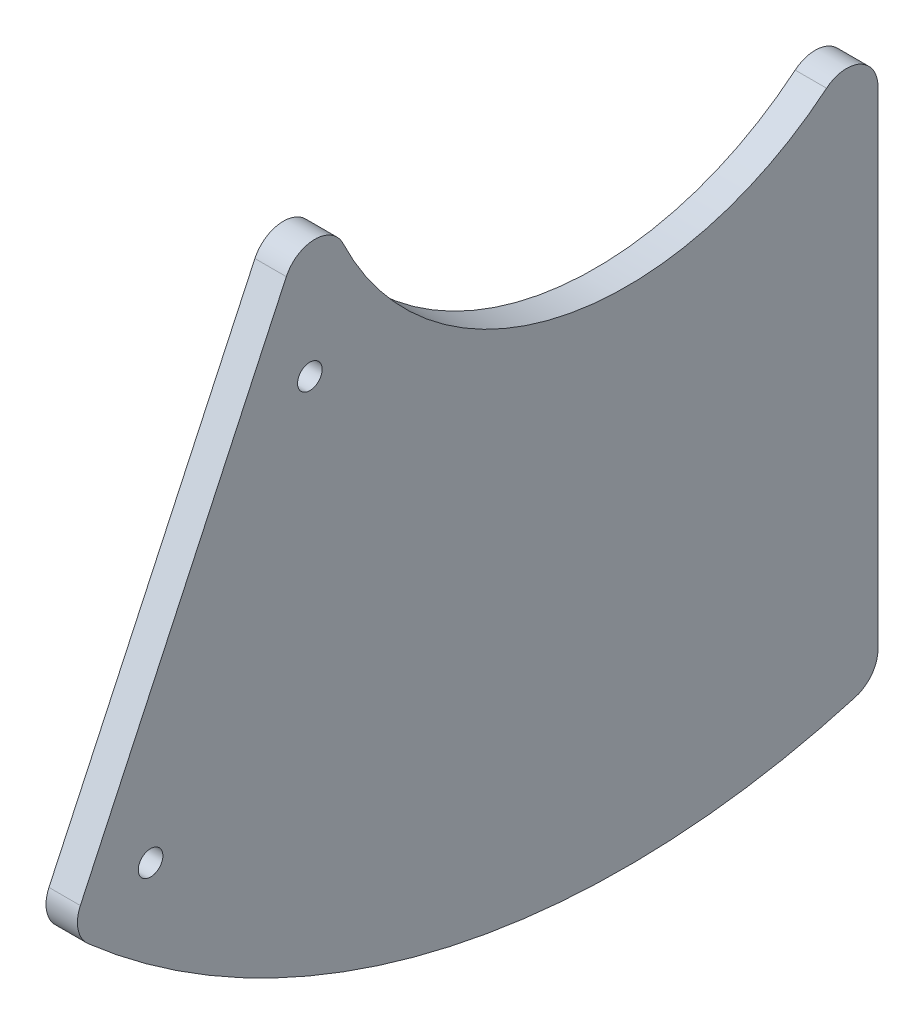
ISO-10303-21;
HEADER;
FILE_DESCRIPTION(('STEP AP214'),'2;1');
FILE_NAME('part.step','',(''),(''),'','','');
FILE_SCHEMA(('AUTOMOTIVE_DESIGN { 1 0 10303 214 1 1 1 1 }'));
ENDSEC;
DATA;
#1=APPLICATION_CONTEXT('core data for automotive mechanical design processes');
#2=APPLICATION_PROTOCOL_DEFINITION('international standard','automotive_design',2000,#1);
#3=PRODUCT_CONTEXT('',#1,'mechanical');
#4=PRODUCT('Part','Part','',(#3));
#5=PRODUCT_RELATED_PRODUCT_CATEGORY('part','',(#4));
#6=PRODUCT_DEFINITION_FORMATION('','',#4);
#7=PRODUCT_DEFINITION_CONTEXT('part definition',#1,'design');
#8=PRODUCT_DEFINITION('design','',#6,#7);
#9=PRODUCT_DEFINITION_SHAPE('','',#8);
#10=(LENGTH_UNIT() NAMED_UNIT(*) SI_UNIT(.MILLI.,.METRE.));
#11=(NAMED_UNIT(*) PLANE_ANGLE_UNIT() SI_UNIT($,.RADIAN.));
#12=(NAMED_UNIT(*) SI_UNIT($,.STERADIAN.) SOLID_ANGLE_UNIT());
#13=UNCERTAINTY_MEASURE_WITH_UNIT(LENGTH_MEASURE(1.E-05),#10,'distance_accuracy_value','');
#14=(GEOMETRIC_REPRESENTATION_CONTEXT(3) GLOBAL_UNCERTAINTY_ASSIGNED_CONTEXT((#13)) GLOBAL_UNIT_ASSIGNED_CONTEXT((#10,
#11,#12)) REPRESENTATION_CONTEXT('',''));
#15=CARTESIAN_POINT('',(0.,0.,0.));
#16=DIRECTION('',(0.,0.,1.));
#17=DIRECTION('',(1.,0.,0.));
#18=AXIS2_PLACEMENT_3D('',#15,#16,#17);
#19=CARTESIAN_POINT('',(6.35,0.,0.));
#20=DIRECTION('',(-1.,0.,0.));
#21=DIRECTION('',(0.,0.,1.));
#22=AXIS2_PLACEMENT_3D('',#19,#20,#21);
#23=CYLINDRICAL_SURFACE('',#22,165.1);
#24=CARTESIAN_POINT('',(6.35,0.,0.));
#25=DIRECTION('',(1.,0.,0.));
#26=DIRECTION('',(0.,0.,-1.));
#27=AXIS2_PLACEMENT_3D('',#24,#25,#26);
#28=CIRCLE('',#27,165.1);
#29=CARTESIAN_POINT('',(6.35,-124.109362010412,108.880100391984));
#30=VERTEX_POINT('',#29);
#31=CARTESIAN_POINT('',(6.35,-158.496,-46.228));
#32=VERTEX_POINT('',#31);
#33=EDGE_CURVE('E132',#30,#32,#28,.T.);
#34=ORIENTED_EDGE('',*,*,#33,.F.);
#35=DIRECTION('',(-1.,0.,0.));
#36=VECTOR('',#35,1.);
#37=CARTESIAN_POINT('',(6.35,-124.109362010412,108.880100391984));
#38=LINE('',#37,#36);
#39=CARTESIAN_POINT('',(0.,-124.109362010412,108.880100391984));
#40=VERTEX_POINT('',#39);
#41=EDGE_CURVE('E116',#30,#40,#38,.T.);
#42=ORIENTED_EDGE('',*,*,#41,.T.);
#43=CARTESIAN_POINT('',(0.,0.,0.));
#44=DIRECTION('',(1.,0.,0.));
#45=DIRECTION('',(0.,0.,-1.));
#46=AXIS2_PLACEMENT_3D('',#43,#44,#45);
#47=CIRCLE('',#46,165.1);
#48=CARTESIAN_POINT('',(0.,-158.496,-46.228));
#49=VERTEX_POINT('',#48);
#50=EDGE_CURVE('E129',#40,#49,#47,.T.);
#51=ORIENTED_EDGE('',*,*,#50,.T.);
#52=DIRECTION('',(-1.,0.,0.));
#53=VECTOR('',#52,1.);
#54=CARTESIAN_POINT('',(6.35,-158.496,-46.228));
#55=LINE('',#54,#53);
#56=EDGE_CURVE('E135',#49,#32,#55,.F.);
#57=ORIENTED_EDGE('',*,*,#56,.T.);
#58=EDGE_LOOP('',(#34,#42,#51,#57));
#59=FACE_BOUND('',#58,.T.);
#60=ADVANCED_FACE('F45',(#59),#23,.T.);
#61=CARTESIAN_POINT('',(6.35,-38.1,-50.8));
#62=DIRECTION('',(0.,0.,1.));
#63=DIRECTION('',(0.,-1.,0.));
#64=AXIS2_PLACEMENT_3D('',#61,#62,#63);
#65=PLANE('',#64);
#66=DIRECTION('',(0.,1.,0.));
#67=VECTOR('',#66,1.);
#68=CARTESIAN_POINT('',(6.35,-38.1,-50.8));
#69=LINE('',#68,#67);
#70=CARTESIAN_POINT('',(6.35,-152.4,-50.8));
#71=VERTEX_POINT('',#70);
#72=CARTESIAN_POINT('',(6.35,-53.8815367264149,-50.8));
#73=VERTEX_POINT('',#72);
#74=EDGE_CURVE('E197',#71,#73,#69,.T.);
#75=ORIENTED_EDGE('',*,*,#74,.F.);
#76=DIRECTION('',(-1.,0.,0.));
#77=VECTOR('',#76,1.);
#78=CARTESIAN_POINT('',(6.35,-152.4,-50.8));
#79=LINE('',#78,#77);
#80=CARTESIAN_POINT('',(0.,-152.4,-50.8));
#81=VERTEX_POINT('',#80);
#82=EDGE_CURVE('E188',#71,#81,#79,.T.);
#83=ORIENTED_EDGE('',*,*,#82,.T.);
#84=DIRECTION('',(0.,1.,0.));
#85=VECTOR('',#84,1.);
#86=CARTESIAN_POINT('',(0.,-38.1,-50.8));
#87=LINE('',#86,#85);
#88=CARTESIAN_POINT('',(0.,-53.8815367264149,-50.8));
#89=VERTEX_POINT('',#88);
#90=EDGE_CURVE('E140',#81,#89,#87,.T.);
#91=ORIENTED_EDGE('',*,*,#90,.T.);
#92=DIRECTION('',(-1.,0.,0.));
#93=VECTOR('',#92,1.);
#94=CARTESIAN_POINT('',(6.35,-53.8815367264149,-50.8));
#95=LINE('',#94,#93);
#96=EDGE_CURVE('E185',#89,#73,#95,.F.);
#97=ORIENTED_EDGE('',*,*,#96,.T.);
#98=EDGE_LOOP('',(#75,#83,#91,#97));
#99=FACE_BOUND('',#98,.T.);
#100=ADVANCED_FACE('F236',(#99),#65,.F.);
#101=CARTESIAN_POINT('',(6.35,0.,0.));
#102=DIRECTION('',(-1.,0.,0.));
#103=DIRECTION('',(0.,0.,1.));
#104=AXIS2_PLACEMENT_3D('',#101,#102,#103);
#105=CYLINDRICAL_SURFACE('',#104,63.5);
#106=CARTESIAN_POINT('',(6.35,0.,0.));
#107=DIRECTION('',(-1.,0.,0.));
#108=DIRECTION('',(0.,0.,-1.));
#109=AXIS2_PLACEMENT_3D('',#106,#107,#108);
#110=CIRCLE('',#109,63.5);
#111=CARTESIAN_POINT('',(6.35,-48.9832152058317,-40.4090909090909));
#112=VERTEX_POINT('',#111);
#113=CARTESIAN_POINT('',(6.35,-27.3162496166154,57.3242750227402));
#114=VERTEX_POINT('',#113);
#115=EDGE_CURVE('E195',#112,#114,#110,.T.);
#116=ORIENTED_EDGE('',*,*,#115,.F.);
#117=DIRECTION('',(-1.,0.,0.));
#118=VECTOR('',#117,1.);
#119=CARTESIAN_POINT('',(6.35,-48.9832152058317,-40.4090909090909));
#120=LINE('',#119,#118);
#121=CARTESIAN_POINT('',(0.,-48.9832152058317,-40.4090909090909));
#122=VERTEX_POINT('',#121);
#123=EDGE_CURVE('E11',#112,#122,#120,.T.);
#124=ORIENTED_EDGE('',*,*,#123,.T.);
#125=CARTESIAN_POINT('',(0.,0.,0.));
#126=DIRECTION('',(-1.,0.,0.));
#127=DIRECTION('',(0.,0.,-1.));
#128=AXIS2_PLACEMENT_3D('',#125,#126,#127);
#129=CIRCLE('',#128,63.5);
#130=CARTESIAN_POINT('',(0.,-27.3162496166154,57.3242750227402));
#131=VERTEX_POINT('',#130);
#132=EDGE_CURVE('E146',#122,#131,#129,.T.);
#133=ORIENTED_EDGE('',*,*,#132,.T.);
#134=DIRECTION('',(-1.,0.,0.));
#135=VECTOR('',#134,1.);
#136=CARTESIAN_POINT('',(6.35,-27.3162496166154,57.3242750227402));
#137=LINE('',#136,#135);
#138=EDGE_CURVE('E54',#131,#114,#137,.F.);
#139=ORIENTED_EDGE('',*,*,#138,.T.);
#140=EDGE_LOOP('',(#116,#124,#133,#139));
#141=FACE_BOUND('',#140,.T.);
#142=ADVANCED_FACE('F229',(#141),#105,.F.);
#143=CARTESIAN_POINT('',(6.35,-13.0613189896688,62.1421913537825));
#144=DIRECTION('',(0.,-0.4226182617407,-0.90630778703665));
#145=DIRECTION('',(0.,0.90630778703665,-0.4226182617407));
#146=AXIS2_PLACEMENT_3D('',#143,#144,#145);
#147=PLANE('',#146);
#148=DIRECTION('',(0.,-0.90630778703665,0.4226182617407));
#149=VECTOR('',#148,1.);
#150=CARTESIAN_POINT('',(0.,-13.0613189896688,62.1421913537825));
#151=LINE('',#150,#149);
#152=CARTESIAN_POINT('',(0.,-27.3642486162235,68.811756972697));
#153=VERTEX_POINT('',#152);
#154=CARTESIAN_POINT('',(0.,-116.652299047958,110.447458670744));
#155=VERTEX_POINT('',#154);
#156=EDGE_CURVE('E157',#153,#155,#151,.T.);
#157=ORIENTED_EDGE('',*,*,#156,.T.);
#158=DIRECTION('',(-1.,0.,0.));
#159=VECTOR('',#158,1.);
#160=CARTESIAN_POINT('',(6.35,-116.652299047958,110.447458670744));
#161=LINE('',#160,#159);
#162=CARTESIAN_POINT('',(6.35,-116.652299047958,110.447458670744));
#163=VERTEX_POINT('',#162);
#164=EDGE_CURVE('E117',#155,#163,#161,.F.);
#165=ORIENTED_EDGE('',*,*,#164,.T.);
#166=DIRECTION('',(0.,-0.90630778703665,0.4226182617407));
#167=VECTOR('',#166,1.);
#168=CARTESIAN_POINT('',(6.35,-13.0613189896688,62.1421913537825));
#169=LINE('',#168,#167);
#170=CARTESIAN_POINT('',(6.35,-27.3642486162235,68.811756972697));
#171=VERTEX_POINT('',#170);
#172=EDGE_CURVE('E152',#171,#163,#169,.T.);
#173=ORIENTED_EDGE('',*,*,#172,.F.);
#174=DIRECTION('',(-1.,0.,0.));
#175=VECTOR('',#174,1.);
#176=CARTESIAN_POINT('',(6.35,-27.3642486162235,68.811756972697));
#177=LINE('',#176,#175);
#178=EDGE_CURVE('E123',#171,#153,#177,.T.);
#179=ORIENTED_EDGE('',*,*,#178,.T.);
#180=EDGE_LOOP('',(#157,#165,#173,#179));
#181=FACE_BOUND('',#180,.T.);
#182=ADVANCED_FACE('F220',(#181),#147,.F.);
#183=CARTESIAN_POINT('',(6.35,0.,0.));
#184=DIRECTION('',(1.,0.,0.));
#185=DIRECTION('',(0.,0.,-1.));
#186=AXIS2_PLACEMENT_3D('',#183,#184,#185);
#187=PLANE('',#186);
#188=CARTESIAN_POINT('',(6.35,-116.264496524382,96.2537238133256));
#189=DIRECTION('',(1.,0.,0.));
#190=DIRECTION('',(0.,0.,-1.));
#191=AXIS2_PLACEMENT_3D('',#188,#189,#190);
#192=CIRCLE('',#191,2.4892);
#193=CARTESIAN_POINT('',(6.35,-116.264496524382,93.7645238133256));
#194=VERTEX_POINT('',#193);
#195=EDGE_CURVE('E210',#194,#194,#192,.T.);
#196=ORIENTED_EDGE('',*,*,#195,.F.);
#197=EDGE_LOOP('',(#196));
#198=FACE_BOUND('',#197,.T.);
#199=CARTESIAN_POINT('',(6.35,-47.2038431521893,64.0502122686842));
#200=DIRECTION('',(1.,0.,0.));
#201=DIRECTION('',(0.,0.,-1.));
#202=AXIS2_PLACEMENT_3D('',#199,#200,#201);
#203=CIRCLE('',#202,2.4892);
#204=CARTESIAN_POINT('',(6.35,-47.2038431521893,61.5610122686842));
#205=VERTEX_POINT('',#204);
#206=EDGE_CURVE('E149',#205,#205,#203,.T.);
#207=ORIENTED_EDGE('',*,*,#206,.F.);
#208=EDGE_LOOP('',(#207));
#209=FACE_BOUND('',#208,.T.);
#210=ORIENTED_EDGE('',*,*,#172,.T.);
#211=CARTESIAN_POINT('',(6.35,-119.335925010011,104.692404223062));
#212=DIRECTION('',(1.,0.,0.));
#213=DIRECTION('',(0.,0.,-1.));
#214=AXIS2_PLACEMENT_3D('',#211,#212,#213);
#215=CIRCLE('',#214,6.35);
#216=EDGE_CURVE('E182',#163,#30,#215,.T.);
#217=ORIENTED_EDGE('',*,*,#216,.T.);
#218=ORIENTED_EDGE('',*,*,#33,.T.);
#219=CARTESIAN_POINT('',(6.35,-152.4,-44.45));
#220=DIRECTION('',(1.,0.,0.));
#221=DIRECTION('',(0.,0.,-1.));
#222=AXIS2_PLACEMENT_3D('',#219,#220,#221);
#223=CIRCLE('',#222,6.35);
#224=EDGE_CURVE('E179',#32,#71,#223,.T.);
#225=ORIENTED_EDGE('',*,*,#224,.T.);
#226=ORIENTED_EDGE('',*,*,#74,.T.);
#227=CARTESIAN_POINT('',(6.35,-53.8815367264149,-44.45));
#228=DIRECTION('',(1.,0.,0.));
#229=DIRECTION('',(0.,0.,-1.));
#230=AXIS2_PLACEMENT_3D('',#227,#228,#229);
#231=CIRCLE('',#230,6.35);
#232=EDGE_CURVE('E67',#73,#112,#231,.T.);
#233=ORIENTED_EDGE('',*,*,#232,.T.);
#234=ORIENTED_EDGE('',*,*,#115,.T.);
#235=CARTESIAN_POINT('',(6.35,-30.047874578277,63.0567025250142));
#236=DIRECTION('',(1.,0.,0.));
#237=DIRECTION('',(0.,0.,-1.));
#238=AXIS2_PLACEMENT_3D('',#235,#236,#237);
#239=CIRCLE('',#238,6.35);
#240=EDGE_CURVE('E174',#114,#171,#239,.T.);
#241=ORIENTED_EDGE('',*,*,#240,.T.);
#242=EDGE_LOOP('',(#210,#217,#218,#225,#226,#233,#234,#241));
#243=FACE_BOUND('',#242,.T.);
#244=ADVANCED_FACE('F217',(#198,#209,#243),#187,.T.);
#245=CARTESIAN_POINT('',(0.,0.,0.));
#246=DIRECTION('',(1.,0.,0.));
#247=DIRECTION('',(0.,0.,-1.));
#248=AXIS2_PLACEMENT_3D('',#245,#246,#247);
#249=PLANE('',#248);
#250=CARTESIAN_POINT('',(0.,-116.264496524382,96.2537238133256));
#251=DIRECTION('',(1.,0.,0.));
#252=DIRECTION('',(0.,0.,-1.));
#253=AXIS2_PLACEMENT_3D('',#250,#251,#252);
#254=CIRCLE('',#253,2.4892);
#255=CARTESIAN_POINT('',(0.,-116.264496524382,93.7645238133256));
#256=VERTEX_POINT('',#255);
#257=EDGE_CURVE('E206',#256,#256,#254,.T.);
#258=ORIENTED_EDGE('',*,*,#257,.T.);
#259=EDGE_LOOP('',(#258));
#260=FACE_BOUND('',#259,.T.);
#261=CARTESIAN_POINT('',(0.,-47.2038431521893,64.0502122686842));
#262=DIRECTION('',(1.,0.,0.));
#263=DIRECTION('',(0.,0.,-1.));
#264=AXIS2_PLACEMENT_3D('',#261,#262,#263);
#265=CIRCLE('',#264,2.4892);
#266=CARTESIAN_POINT('',(0.,-47.2038431521893,61.5610122686842));
#267=VERTEX_POINT('',#266);
#268=EDGE_CURVE('E141',#267,#267,#265,.T.);
#269=ORIENTED_EDGE('',*,*,#268,.T.);
#270=EDGE_LOOP('',(#269));
#271=FACE_BOUND('',#270,.T.);
#272=ORIENTED_EDGE('',*,*,#50,.F.);
#273=CARTESIAN_POINT('',(0.,-119.335925010011,104.692404223062));
#274=DIRECTION('',(1.,0.,0.));
#275=DIRECTION('',(0.,0.,-1.));
#276=AXIS2_PLACEMENT_3D('',#273,#274,#275);
#277=CIRCLE('',#276,6.35);
#278=EDGE_CURVE('E112',#40,#155,#277,.F.);
#279=ORIENTED_EDGE('',*,*,#278,.T.);
#280=ORIENTED_EDGE('',*,*,#156,.F.);
#281=CARTESIAN_POINT('',(0.,-30.047874578277,63.0567025250142));
#282=DIRECTION('',(1.,0.,0.));
#283=DIRECTION('',(0.,0.,-1.));
#284=AXIS2_PLACEMENT_3D('',#281,#282,#283);
#285=CIRCLE('',#284,6.35);
#286=EDGE_CURVE('E134',#153,#131,#285,.F.);
#287=ORIENTED_EDGE('',*,*,#286,.T.);
#288=ORIENTED_EDGE('',*,*,#132,.F.);
#289=CARTESIAN_POINT('',(0.,-53.8815367264149,-44.45));
#290=DIRECTION('',(1.,0.,0.));
#291=DIRECTION('',(0.,0.,-1.));
#292=AXIS2_PLACEMENT_3D('',#289,#290,#291);
#293=CIRCLE('',#292,6.35);
#294=EDGE_CURVE('E164',#122,#89,#293,.F.);
#295=ORIENTED_EDGE('',*,*,#294,.T.);
#296=ORIENTED_EDGE('',*,*,#90,.F.);
#297=CARTESIAN_POINT('',(0.,-152.4,-44.45));
#298=DIRECTION('',(1.,0.,0.));
#299=DIRECTION('',(0.,0.,-1.));
#300=AXIS2_PLACEMENT_3D('',#297,#298,#299);
#301=CIRCLE('',#300,6.35);
#302=EDGE_CURVE('E124',#81,#49,#301,.F.);
#303=ORIENTED_EDGE('',*,*,#302,.T.);
#304=EDGE_LOOP('',(#272,#279,#280,#287,#288,#295,#296,#303));
#305=FACE_BOUND('',#304,.T.);
#306=ADVANCED_FACE('F137',(#260,#271,#305),#249,.F.);
#307=CARTESIAN_POINT('',(6.35,-47.2038431521893,64.0502122686842));
#308=DIRECTION('',(1.,0.,0.));
#309=DIRECTION('',(0.,0.,-1.));
#310=AXIS2_PLACEMENT_3D('',#307,#308,#309);
#311=CYLINDRICAL_SURFACE('',#310,2.4892);
#312=ORIENTED_EDGE('',*,*,#268,.F.);
#313=EDGE_LOOP('',(#312));
#314=FACE_BOUND('',#313,.T.);
#315=ORIENTED_EDGE('',*,*,#206,.T.);
#316=EDGE_LOOP('',(#315));
#317=FACE_BOUND('',#316,.T.);
#318=ADVANCED_FACE('F260',(#314,#317),#311,.F.);
#319=CARTESIAN_POINT('',(6.35,-116.264496524382,96.2537238133256));
#320=DIRECTION('',(1.,0.,0.));
#321=DIRECTION('',(0.,0.,-1.));
#322=AXIS2_PLACEMENT_3D('',#319,#320,#321);
#323=CYLINDRICAL_SURFACE('',#322,2.4892);
#324=ORIENTED_EDGE('',*,*,#257,.F.);
#325=EDGE_LOOP('',(#324));
#326=FACE_BOUND('',#325,.T.);
#327=ORIENTED_EDGE('',*,*,#195,.T.);
#328=EDGE_LOOP('',(#327));
#329=FACE_BOUND('',#328,.T.);
#330=ADVANCED_FACE('F215',(#326,#329),#323,.F.);
#331=CARTESIAN_POINT('',(6.35,-119.335925010011,104.692404223062));
#332=DIRECTION('',(-1.,0.,0.));
#333=DIRECTION('',(0.,0.,1.));
#334=AXIS2_PLACEMENT_3D('',#331,#332,#333);
#335=CYLINDRICAL_SURFACE('',#334,6.35);
#336=ORIENTED_EDGE('',*,*,#216,.F.);
#337=ORIENTED_EDGE('',*,*,#164,.F.);
#338=ORIENTED_EDGE('',*,*,#278,.F.);
#339=ORIENTED_EDGE('',*,*,#41,.F.);
#340=EDGE_LOOP('',(#336,#337,#338,#339));
#341=FACE_BOUND('',#340,.T.);
#342=ADVANCED_FACE('F115',(#341),#335,.T.);
#343=CARTESIAN_POINT('',(6.35,-152.4,-44.45));
#344=DIRECTION('',(-1.,0.,0.));
#345=DIRECTION('',(0.,0.,1.));
#346=AXIS2_PLACEMENT_3D('',#343,#344,#345);
#347=CYLINDRICAL_SURFACE('',#346,6.35);
#348=ORIENTED_EDGE('',*,*,#224,.F.);
#349=ORIENTED_EDGE('',*,*,#56,.F.);
#350=ORIENTED_EDGE('',*,*,#302,.F.);
#351=ORIENTED_EDGE('',*,*,#82,.F.);
#352=EDGE_LOOP('',(#348,#349,#350,#351));
#353=FACE_BOUND('',#352,.T.);
#354=ADVANCED_FACE('F239',(#353),#347,.T.);
#355=CARTESIAN_POINT('',(6.35,-53.8815367264149,-44.45));
#356=DIRECTION('',(-1.,0.,0.));
#357=DIRECTION('',(0.,0.,1.));
#358=AXIS2_PLACEMENT_3D('',#355,#356,#357);
#359=CYLINDRICAL_SURFACE('',#358,6.35);
#360=ORIENTED_EDGE('',*,*,#232,.F.);
#361=ORIENTED_EDGE('',*,*,#96,.F.);
#362=ORIENTED_EDGE('',*,*,#294,.F.);
#363=ORIENTED_EDGE('',*,*,#123,.F.);
#364=EDGE_LOOP('',(#360,#361,#362,#363));
#365=FACE_BOUND('',#364,.T.);
#366=ADVANCED_FACE('F232',(#365),#359,.T.);
#367=CARTESIAN_POINT('',(6.35,-30.047874578277,63.0567025250142));
#368=DIRECTION('',(-1.,0.,0.));
#369=DIRECTION('',(0.,0.,1.));
#370=AXIS2_PLACEMENT_3D('',#367,#368,#369);
#371=CYLINDRICAL_SURFACE('',#370,6.35);
#372=ORIENTED_EDGE('',*,*,#240,.F.);
#373=ORIENTED_EDGE('',*,*,#138,.F.);
#374=ORIENTED_EDGE('',*,*,#286,.F.);
#375=ORIENTED_EDGE('',*,*,#178,.F.);
#376=EDGE_LOOP('',(#372,#373,#374,#375));
#377=FACE_BOUND('',#376,.T.);
#378=ADVANCED_FACE('F47',(#377),#371,.T.);
#379=CLOSED_SHELL('',(#60,#100,#142,#182,#244,#306,#318,#330,#342,#354,#366,#378));
#380=MANIFOLD_SOLID_BREP('B2',#379);
#381=ADVANCED_BREP_SHAPE_REPRESENTATION('',(#18,#380),#14);
#382=SHAPE_DEFINITION_REPRESENTATION(#9,#381);
ENDSEC;
END-ISO-10303-21;
